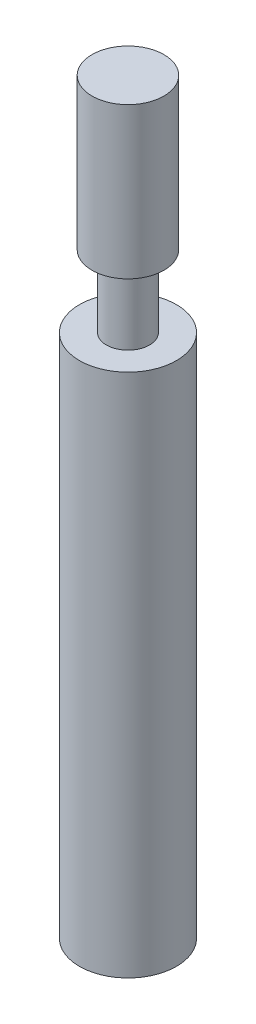
ISO-10303-21;
HEADER;
FILE_DESCRIPTION(('STEP AP214'),'2;1');
FILE_NAME('part.step','',(''),(''),'','','');
FILE_SCHEMA(('AUTOMOTIVE_DESIGN { 1 0 10303 214 1 1 1 1 }'));
ENDSEC;
DATA;
#1=APPLICATION_CONTEXT('core data for automotive mechanical design processes');
#2=APPLICATION_PROTOCOL_DEFINITION('international standard','automotive_design',2000,#1);
#3=PRODUCT_CONTEXT('',#1,'mechanical');
#4=PRODUCT('Part','Part','',(#3));
#5=PRODUCT_RELATED_PRODUCT_CATEGORY('part','',(#4));
#6=PRODUCT_DEFINITION_FORMATION('','',#4);
#7=PRODUCT_DEFINITION_CONTEXT('part definition',#1,'design');
#8=PRODUCT_DEFINITION('design','',#6,#7);
#9=PRODUCT_DEFINITION_SHAPE('','',#8);
#10=(LENGTH_UNIT() NAMED_UNIT(*) SI_UNIT(.MILLI.,.METRE.));
#11=(NAMED_UNIT(*) PLANE_ANGLE_UNIT() SI_UNIT($,.RADIAN.));
#12=(NAMED_UNIT(*) SI_UNIT($,.STERADIAN.) SOLID_ANGLE_UNIT());
#13=UNCERTAINTY_MEASURE_WITH_UNIT(LENGTH_MEASURE(1.E-05),#10,'distance_accuracy_value','');
#14=(GEOMETRIC_REPRESENTATION_CONTEXT(3) GLOBAL_UNCERTAINTY_ASSIGNED_CONTEXT((#13)) GLOBAL_UNIT_ASSIGNED_CONTEXT((#10,
#11,#12)) REPRESENTATION_CONTEXT('',''));
#15=CARTESIAN_POINT('',(0.,0.,0.));
#16=DIRECTION('',(0.,0.,1.));
#17=DIRECTION('',(1.,0.,0.));
#18=AXIS2_PLACEMENT_3D('',#15,#16,#17);
#19=CARTESIAN_POINT('',(0.,41.5,0.));
#20=DIRECTION('',(0.,-1.,0.));
#21=DIRECTION('',(0.,0.,-1.));
#22=AXIS2_PLACEMENT_3D('',#19,#20,#21);
#23=CYLINDRICAL_SURFACE('',#22,3.375);
#24=CARTESIAN_POINT('',(0.,0.,0.));
#25=DIRECTION('',(0.,1.,0.));
#26=DIRECTION('',(0.,0.,1.));
#27=AXIS2_PLACEMENT_3D('',#24,#25,#26);
#28=CIRCLE('',#27,3.375);
#29=CARTESIAN_POINT('',(0.,0.,3.375));
#30=VERTEX_POINT('',#29);
#31=EDGE_CURVE('E10',#30,#30,#28,.T.);
#32=ORIENTED_EDGE('',*,*,#31,.T.);
#33=EDGE_LOOP('',(#32));
#34=FACE_BOUND('',#33,.T.);
#35=CARTESIAN_POINT('',(0.,36.5,0.));
#36=DIRECTION('',(0.,1.,0.));
#37=DIRECTION('',(0.,0.,1.));
#38=AXIS2_PLACEMENT_3D('',#35,#36,#37);
#39=CIRCLE('',#38,3.375);
#40=CARTESIAN_POINT('',(0.,36.5,3.375));
#41=VERTEX_POINT('',#40);
#42=EDGE_CURVE('E56',#41,#41,#39,.T.);
#43=ORIENTED_EDGE('',*,*,#42,.F.);
#44=EDGE_LOOP('',(#43));
#45=FACE_BOUND('',#44,.T.);
#46=ADVANCED_FACE('F39',(#34,#45),#23,.T.);
#47=CARTESIAN_POINT('',(0.,0.,0.));
#48=DIRECTION('',(0.,1.,0.));
#49=DIRECTION('',(0.,0.,1.));
#50=AXIS2_PLACEMENT_3D('',#47,#48,#49);
#51=PLANE('',#50);
#52=ORIENTED_EDGE('',*,*,#31,.F.);
#53=EDGE_LOOP('',(#52));
#54=FACE_BOUND('',#53,.T.);
#55=ADVANCED_FACE('F82',(#54),#51,.F.);
#56=CARTESIAN_POINT('',(0.,41.5,0.));
#57=DIRECTION('',(0.,1.,0.));
#58=DIRECTION('',(0.,0.,1.));
#59=AXIS2_PLACEMENT_3D('',#56,#57,#58);
#60=PLANE('',#59);
#61=CARTESIAN_POINT('',(0.,41.5,0.));
#62=DIRECTION('',(0.,1.,0.));
#63=DIRECTION('',(0.,0.,1.));
#64=AXIS2_PLACEMENT_3D('',#61,#62,#63);
#65=CIRCLE('',#64,1.5);
#66=CARTESIAN_POINT('',(0.,41.5,1.5));
#67=VERTEX_POINT('',#66);
#68=EDGE_CURVE('E63',#67,#67,#65,.T.);
#69=ORIENTED_EDGE('',*,*,#68,.T.);
#70=EDGE_LOOP('',(#69));
#71=FACE_BOUND('',#70,.T.);
#72=CARTESIAN_POINT('',(0.,41.5,0.));
#73=DIRECTION('',(0.,1.,0.));
#74=DIRECTION('',(0.,0.,1.));
#75=AXIS2_PLACEMENT_3D('',#72,#73,#74);
#76=CIRCLE('',#75,2.5);
#77=CARTESIAN_POINT('',(0.,41.5,-2.5));
#78=VERTEX_POINT('',#77);
#79=EDGE_CURVE('E51',#78,#78,#76,.T.);
#80=ORIENTED_EDGE('',*,*,#79,.F.);
#81=EDGE_LOOP('',(#80));
#82=FACE_BOUND('',#81,.T.);
#83=ADVANCED_FACE('F77',(#71,#82),#60,.F.);
#84=CARTESIAN_POINT('',(0.,36.5,0.));
#85=DIRECTION('',(0.,1.,0.));
#86=DIRECTION('',(0.,0.,1.));
#87=AXIS2_PLACEMENT_3D('',#84,#85,#86);
#88=PLANE('',#87);
#89=CARTESIAN_POINT('',(0.,36.5,0.));
#90=DIRECTION('',(0.,1.,0.));
#91=DIRECTION('',(0.,0.,1.));
#92=AXIS2_PLACEMENT_3D('',#89,#90,#91);
#93=CIRCLE('',#92,1.5);
#94=CARTESIAN_POINT('',(0.,36.5,1.5));
#95=VERTEX_POINT('',#94);
#96=EDGE_CURVE('E62',#95,#95,#93,.T.);
#97=ORIENTED_EDGE('',*,*,#96,.F.);
#98=EDGE_LOOP('',(#97));
#99=FACE_BOUND('',#98,.T.);
#100=ORIENTED_EDGE('',*,*,#42,.T.);
#101=EDGE_LOOP('',(#100));
#102=FACE_BOUND('',#101,.T.);
#103=ADVANCED_FACE('F74',(#99,#102),#88,.T.);
#104=CARTESIAN_POINT('',(0.,36.5,0.));
#105=DIRECTION('',(0.,1.,0.));
#106=DIRECTION('',(0.,0.,1.));
#107=AXIS2_PLACEMENT_3D('',#104,#105,#106);
#108=CYLINDRICAL_SURFACE('',#107,1.5);
#109=ORIENTED_EDGE('',*,*,#96,.T.);
#110=EDGE_LOOP('',(#109));
#111=FACE_BOUND('',#110,.T.);
#112=ORIENTED_EDGE('',*,*,#68,.F.);
#113=EDGE_LOOP('',(#112));
#114=FACE_BOUND('',#113,.T.);
#115=ADVANCED_FACE('F71',(#111,#114),#108,.T.);
#116=CARTESIAN_POINT('',(0.,52.,0.));
#117=DIRECTION('',(0.,1.,0.));
#118=DIRECTION('',(0.,0.,1.));
#119=AXIS2_PLACEMENT_3D('',#116,#117,#118);
#120=PLANE('',#119);
#121=CARTESIAN_POINT('',(0.,52.,0.));
#122=DIRECTION('',(0.,1.,0.));
#123=DIRECTION('',(0.,0.,1.));
#124=AXIS2_PLACEMENT_3D('',#121,#122,#123);
#125=CIRCLE('',#124,2.5);
#126=CARTESIAN_POINT('',(0.,52.,-2.5));
#127=VERTEX_POINT('',#126);
#128=EDGE_CURVE('E46',#127,#127,#125,.T.);
#129=ORIENTED_EDGE('',*,*,#128,.T.);
#130=EDGE_LOOP('',(#129));
#131=FACE_BOUND('',#130,.T.);
#132=ADVANCED_FACE('F96',(#131),#120,.T.);
#133=CARTESIAN_POINT('',(0.,52.,0.));
#134=DIRECTION('',(0.,-1.,0.));
#135=DIRECTION('',(0.,0.,-1.));
#136=AXIS2_PLACEMENT_3D('',#133,#134,#135);
#137=CYLINDRICAL_SURFACE('',#136,2.5);
#138=CARTESIAN_POINT('',(0.,52.,-2.5));
#139=CARTESIAN_POINT('',(0.,51.890625,-2.5));
#140=CARTESIAN_POINT('',(0.,51.78125,-2.5));
#141=CARTESIAN_POINT('',(0.,51.5625,-2.5));
#142=CARTESIAN_POINT('',(0.,51.453125,-2.5));
#143=CARTESIAN_POINT('',(0.,51.234375,-2.5));
#144=CARTESIAN_POINT('',(0.,51.125,-2.5));
#145=CARTESIAN_POINT('',(0.,50.90625,-2.5));
#146=CARTESIAN_POINT('',(0.,50.796875,-2.5));
#147=CARTESIAN_POINT('',(0.,50.578125,-2.5));
#148=CARTESIAN_POINT('',(0.,50.46875,-2.5));
#149=CARTESIAN_POINT('',(0.,50.25,-2.5));
#150=CARTESIAN_POINT('',(0.,50.140625,-2.5));
#151=CARTESIAN_POINT('',(0.,49.921875,-2.5));
#152=CARTESIAN_POINT('',(0.,49.8125,-2.5));
#153=CARTESIAN_POINT('',(0.,49.59375,-2.5));
#154=CARTESIAN_POINT('',(0.,49.484375,-2.5));
#155=CARTESIAN_POINT('',(0.,49.265625,-2.5));
#156=CARTESIAN_POINT('',(0.,49.15625,-2.5));
#157=CARTESIAN_POINT('',(0.,48.9375,-2.5));
#158=CARTESIAN_POINT('',(0.,48.828125,-2.5));
#159=CARTESIAN_POINT('',(0.,48.609375,-2.5));
#160=CARTESIAN_POINT('',(0.,48.5,-2.5));
#161=CARTESIAN_POINT('',(0.,48.28125,-2.5));
#162=CARTESIAN_POINT('',(0.,48.171875,-2.5));
#163=CARTESIAN_POINT('',(0.,47.953125,-2.5));
#164=CARTESIAN_POINT('',(0.,47.84375,-2.5));
#165=CARTESIAN_POINT('',(0.,47.625,-2.5));
#166=CARTESIAN_POINT('',(0.,47.515625,-2.5));
#167=CARTESIAN_POINT('',(0.,47.296875,-2.5));
#168=CARTESIAN_POINT('',(0.,47.1875,-2.5));
#169=CARTESIAN_POINT('',(0.,46.96875,-2.5));
#170=CARTESIAN_POINT('',(0.,46.859375,-2.5));
#171=CARTESIAN_POINT('',(0.,46.640625,-2.5));
#172=CARTESIAN_POINT('',(0.,46.53125,-2.5));
#173=CARTESIAN_POINT('',(0.,46.3125,-2.5));
#174=CARTESIAN_POINT('',(0.,46.203125,-2.5));
#175=CARTESIAN_POINT('',(0.,45.984375,-2.5));
#176=CARTESIAN_POINT('',(0.,45.875,-2.5));
#177=CARTESIAN_POINT('',(0.,45.65625,-2.5));
#178=CARTESIAN_POINT('',(0.,45.546875,-2.5));
#179=CARTESIAN_POINT('',(0.,45.328125,-2.5));
#180=CARTESIAN_POINT('',(0.,45.21875,-2.5));
#181=CARTESIAN_POINT('',(0.,45.,-2.5));
#182=CARTESIAN_POINT('',(0.,44.890625,-2.5));
#183=CARTESIAN_POINT('',(0.,44.671875,-2.5));
#184=CARTESIAN_POINT('',(0.,44.5625,-2.5));
#185=CARTESIAN_POINT('',(0.,44.34375,-2.5));
#186=CARTESIAN_POINT('',(0.,44.234375,-2.5));
#187=CARTESIAN_POINT('',(0.,44.015625,-2.5));
#188=CARTESIAN_POINT('',(0.,43.90625,-2.5));
#189=CARTESIAN_POINT('',(0.,43.6875,-2.5));
#190=CARTESIAN_POINT('',(0.,43.578125,-2.5));
#191=CARTESIAN_POINT('',(0.,43.359375,-2.5));
#192=CARTESIAN_POINT('',(0.,43.25,-2.5));
#193=CARTESIAN_POINT('',(0.,43.03125,-2.5));
#194=CARTESIAN_POINT('',(0.,42.921875,-2.5));
#195=CARTESIAN_POINT('',(0.,42.703125,-2.5));
#196=CARTESIAN_POINT('',(0.,42.59375,-2.5));
#197=CARTESIAN_POINT('',(0.,42.375,-2.5));
#198=CARTESIAN_POINT('',(0.,42.265625,-2.5));
#199=CARTESIAN_POINT('',(0.,42.046875,-2.5));
#200=CARTESIAN_POINT('',(0.,41.9375,-2.5));
#201=CARTESIAN_POINT('',(0.,41.71875,-2.5));
#202=CARTESIAN_POINT('',(0.,41.609375,-2.5));
#203=CARTESIAN_POINT('',(0.,41.5,-2.5));
#204=B_SPLINE_CURVE_WITH_KNOTS('',3,(#138,#139,#140,#141,#142,#143,#144,#145,#146,#147,#148,
#149,#150,#151,#152,#153,#154,#155,#156,#157,#158,#159,#160,#161,#162,#163,#164,#165,#166,#167,
#168,#169,#170,#171,#172,#173,#174,#175,#176,#177,#178,#179,#180,#181,#182,#183,#184,#185,#186,
#187,#188,#189,#190,#191,#192,#193,#194,#195,#196,#197,#198,#199,#200,#201,#202,#203),
.UNSPECIFIED.,.F.,.F.,(4,2,2,2,2,2,2,2,2,2,2,2,2,2,2,2,2,2,2,2,2,2,2,2,2,2,2,2,2,2,2,2,4),(0.,
0.328125000000005,0.656250000000004,0.984375000000003,1.3125,1.64062500000001,1.96875000000001,
2.296875,2.625,2.953125,3.28125000000001,3.609375,3.9375,4.265625,4.59375,4.92187500000001,5.25,
5.578125,5.90625,6.234375,6.56250000000001,6.890625,7.21875,7.546875,7.87500000000001,
8.20312500000001,8.53125,8.859375,9.1875,9.515625,9.84375000000001,10.171875,10.5),.UNSPECIFIED.);
#205=EDGE_CURVE('BSEAM93',#127,#78,#204,.T.);
#206=ORIENTED_EDGE('',*,*,#128,.F.);
#207=ORIENTED_EDGE('',*,*,#79,.T.);
#208=ORIENTED_EDGE('',*,*,#205,.T.);
#209=ORIENTED_EDGE('',*,*,#205,.F.);
#210=EDGE_LOOP('',(#206,#208,#207,#209));
#211=FACE_BOUND('',#210,.T.);
#212=ADVANCED_FACE('F93',(#211),#137,.T.);
#213=CLOSED_SHELL('',(#46,#55,#83,#103,#115,#132,#212));
#214=MANIFOLD_SOLID_BREP('B2',#213);
#215=ADVANCED_BREP_SHAPE_REPRESENTATION('',(#18,#214),#14);
#216=SHAPE_DEFINITION_REPRESENTATION(#9,#215);
ENDSEC;
END-ISO-10303-21;
